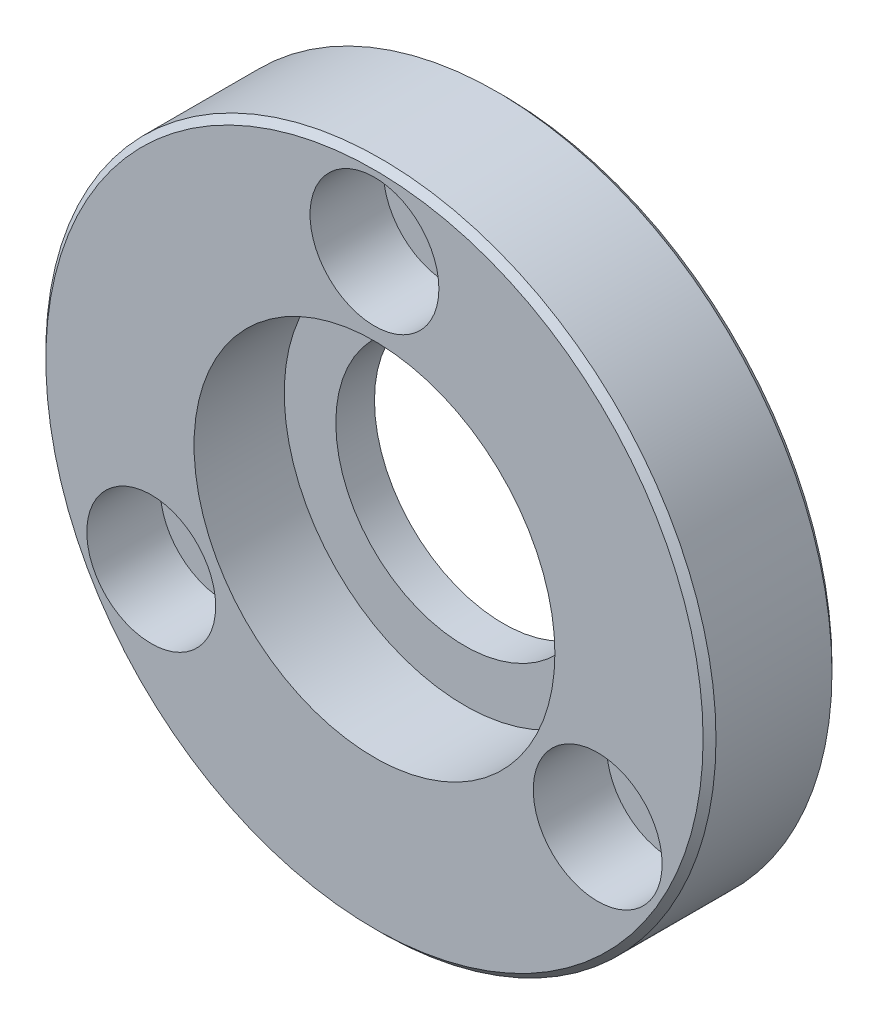
ISO-10303-21;
HEADER;
FILE_DESCRIPTION(('STEP AP214'),'2;1');
FILE_NAME('part.step','',(''),(''),'','','');
FILE_SCHEMA(('AUTOMOTIVE_DESIGN { 1 0 10303 214 1 1 1 1 }'));
ENDSEC;
DATA;
#1=APPLICATION_CONTEXT('core data for automotive mechanical design processes');
#2=APPLICATION_PROTOCOL_DEFINITION('international standard','automotive_design',2000,#1);
#3=PRODUCT_CONTEXT('',#1,'mechanical');
#4=PRODUCT('Part','Part','',(#3));
#5=PRODUCT_RELATED_PRODUCT_CATEGORY('part','',(#4));
#6=PRODUCT_DEFINITION_FORMATION('','',#4);
#7=PRODUCT_DEFINITION_CONTEXT('part definition',#1,'design');
#8=PRODUCT_DEFINITION('design','',#6,#7);
#9=PRODUCT_DEFINITION_SHAPE('','',#8);
#10=(LENGTH_UNIT() NAMED_UNIT(*) SI_UNIT(.MILLI.,.METRE.));
#11=(NAMED_UNIT(*) PLANE_ANGLE_UNIT() SI_UNIT($,.RADIAN.));
#12=(NAMED_UNIT(*) SI_UNIT($,.STERADIAN.) SOLID_ANGLE_UNIT());
#13=UNCERTAINTY_MEASURE_WITH_UNIT(LENGTH_MEASURE(1.E-05),#10,'distance_accuracy_value','');
#14=(GEOMETRIC_REPRESENTATION_CONTEXT(3) GLOBAL_UNCERTAINTY_ASSIGNED_CONTEXT((#13)) GLOBAL_UNIT_ASSIGNED_CONTEXT((#10,
#11,#12)) REPRESENTATION_CONTEXT('',''));
#15=CARTESIAN_POINT('',(0.,0.,0.));
#16=DIRECTION('',(0.,0.,1.));
#17=DIRECTION('',(1.,0.,0.));
#18=AXIS2_PLACEMENT_3D('',#15,#16,#17);
#19=CARTESIAN_POINT('',(0.,0.,5.));
#20=DIRECTION('',(0.,0.,-1.));
#21=DIRECTION('',(-1.,0.,0.));
#22=AXIS2_PLACEMENT_3D('',#19,#20,#21);
#23=CYLINDRICAL_SURFACE('',#22,26.);
#24=CARTESIAN_POINT('',(0.,0.,-4.5));
#25=DIRECTION('',(0.,0.,1.));
#26=DIRECTION('',(1.,0.,0.));
#27=AXIS2_PLACEMENT_3D('',#24,#25,#26);
#28=CIRCLE('',#27,26.);
#29=CARTESIAN_POINT('',(26.,0.,-4.5));
#30=VERTEX_POINT('',#29);
#31=EDGE_CURVE('E45',#30,#30,#28,.T.);
#32=ORIENTED_EDGE('',*,*,#31,.T.);
#33=EDGE_LOOP('',(#32));
#34=FACE_BOUND('',#33,.T.);
#35=CARTESIAN_POINT('',(0.,0.,4.50000000000002));
#36=DIRECTION('',(0.,0.,1.));
#37=DIRECTION('',(1.,0.,0.));
#38=AXIS2_PLACEMENT_3D('',#35,#36,#37);
#39=CIRCLE('',#38,26.);
#40=CARTESIAN_POINT('',(26.,0.,4.50000000000002));
#41=VERTEX_POINT('',#40);
#42=EDGE_CURVE('E49',#41,#41,#39,.F.);
#43=ORIENTED_EDGE('',*,*,#42,.T.);
#44=EDGE_LOOP('',(#43));
#45=FACE_BOUND('',#44,.T.);
#46=ADVANCED_FACE('F34',(#34,#45),#23,.T.);
#47=CARTESIAN_POINT('',(0.,0.,5.));
#48=DIRECTION('',(0.,0.,1.));
#49=DIRECTION('',(1.,0.,0.));
#50=AXIS2_PLACEMENT_3D('',#47,#48,#49);
#51=PLANE('',#50);
#52=CARTESIAN_POINT('',(-17.3205080756889,-9.99999999999984,5.));
#53=DIRECTION('',(0.,0.,1.));
#54=DIRECTION('',(1.,0.,0.));
#55=AXIS2_PLACEMENT_3D('',#52,#53,#54);
#56=CIRCLE('',#55,4.99999999999999);
#57=CARTESIAN_POINT('',(-12.3205080756889,-9.99999999999984,5.));
#58=VERTEX_POINT('',#57);
#59=EDGE_CURVE('E99',#58,#58,#56,.T.);
#60=ORIENTED_EDGE('',*,*,#59,.F.);
#61=EDGE_LOOP('',(#60));
#62=FACE_BOUND('',#61,.T.);
#63=CARTESIAN_POINT('',(17.3205080756887,-10.0000000000001,5.));
#64=DIRECTION('',(0.,0.,1.));
#65=DIRECTION('',(1.,0.,0.));
#66=AXIS2_PLACEMENT_3D('',#63,#64,#65);
#67=CIRCLE('',#66,4.99999999999999);
#68=CARTESIAN_POINT('',(22.3205080756887,-10.0000000000001,5.));
#69=VERTEX_POINT('',#68);
#70=EDGE_CURVE('E87',#69,#69,#67,.T.);
#71=ORIENTED_EDGE('',*,*,#70,.F.);
#72=EDGE_LOOP('',(#71));
#73=FACE_BOUND('',#72,.T.);
#74=CARTESIAN_POINT('',(0.,0.,5.));
#75=DIRECTION('',(0.,0.,1.));
#76=DIRECTION('',(1.,0.,0.));
#77=AXIS2_PLACEMENT_3D('',#74,#75,#76);
#78=CIRCLE('',#77,25.5);
#79=CARTESIAN_POINT('',(25.5,0.,5.));
#80=VERTEX_POINT('',#79);
#81=EDGE_CURVE('E10',#80,#80,#78,.T.);
#82=ORIENTED_EDGE('',*,*,#81,.T.);
#83=EDGE_LOOP('',(#82));
#84=FACE_BOUND('',#83,.T.);
#85=CARTESIAN_POINT('',(0.,20.,5.));
#86=DIRECTION('',(0.,0.,1.));
#87=DIRECTION('',(1.,0.,0.));
#88=AXIS2_PLACEMENT_3D('',#85,#86,#87);
#89=CIRCLE('',#88,4.99999999999999);
#90=CARTESIAN_POINT('',(5.00000000000001,20.,5.));
#91=VERTEX_POINT('',#90);
#92=EDGE_CURVE('E75',#91,#91,#89,.T.);
#93=ORIENTED_EDGE('',*,*,#92,.F.);
#94=EDGE_LOOP('',(#93));
#95=FACE_BOUND('',#94,.T.);
#96=CARTESIAN_POINT('',(0.,0.,5.));
#97=DIRECTION('',(0.,0.,1.));
#98=DIRECTION('',(1.,0.,0.));
#99=AXIS2_PLACEMENT_3D('',#96,#97,#98);
#100=CIRCLE('',#99,14.);
#101=CARTESIAN_POINT('',(14.,0.,5.));
#102=VERTEX_POINT('',#101);
#103=EDGE_CURVE('E55',#102,#102,#100,.T.);
#104=ORIENTED_EDGE('',*,*,#103,.F.);
#105=EDGE_LOOP('',(#104));
#106=FACE_BOUND('',#105,.T.);
#107=ADVANCED_FACE('F105',(#62,#73,#84,#95,#106),#51,.T.);
#108=CARTESIAN_POINT('',(0.,0.,-5.));
#109=DIRECTION('',(0.,0.,1.));
#110=DIRECTION('',(1.,0.,0.));
#111=AXIS2_PLACEMENT_3D('',#108,#109,#110);
#112=PLANE('',#111);
#113=CARTESIAN_POINT('',(-17.3205080756889,-9.99999999999984,-5.));
#114=DIRECTION('',(0.,0.,1.));
#115=DIRECTION('',(1.,0.,0.));
#116=AXIS2_PLACEMENT_3D('',#113,#114,#115);
#117=CIRCLE('',#116,2.75);
#118=CARTESIAN_POINT('',(-14.5705080756889,-9.99999999999984,-5.));
#119=VERTEX_POINT('',#118);
#120=EDGE_CURVE('E90',#119,#119,#117,.T.);
#121=ORIENTED_EDGE('',*,*,#120,.T.);
#122=EDGE_LOOP('',(#121));
#123=FACE_BOUND('',#122,.T.);
#124=CARTESIAN_POINT('',(17.3205080756887,-10.0000000000001,-5.));
#125=DIRECTION('',(0.,0.,1.));
#126=DIRECTION('',(1.,0.,0.));
#127=AXIS2_PLACEMENT_3D('',#124,#125,#126);
#128=CIRCLE('',#127,2.75);
#129=CARTESIAN_POINT('',(20.0705080756887,-10.0000000000001,-5.));
#130=VERTEX_POINT('',#129);
#131=EDGE_CURVE('E78',#130,#130,#128,.T.);
#132=ORIENTED_EDGE('',*,*,#131,.T.);
#133=EDGE_LOOP('',(#132));
#134=FACE_BOUND('',#133,.T.);
#135=CARTESIAN_POINT('',(0.,0.,-5.));
#136=DIRECTION('',(0.,0.,1.));
#137=DIRECTION('',(1.,0.,0.));
#138=AXIS2_PLACEMENT_3D('',#135,#136,#137);
#139=CIRCLE('',#138,25.5);
#140=CARTESIAN_POINT('',(25.5,0.,-5.));
#141=VERTEX_POINT('',#140);
#142=EDGE_CURVE('E41',#141,#141,#139,.F.);
#143=ORIENTED_EDGE('',*,*,#142,.T.);
#144=EDGE_LOOP('',(#143));
#145=FACE_BOUND('',#144,.T.);
#146=CARTESIAN_POINT('',(0.,20.,-5.));
#147=DIRECTION('',(0.,0.,1.));
#148=DIRECTION('',(1.,0.,0.));
#149=AXIS2_PLACEMENT_3D('',#146,#147,#148);
#150=CIRCLE('',#149,2.75);
#151=CARTESIAN_POINT('',(2.75000000000002,20.,-5.));
#152=VERTEX_POINT('',#151);
#153=EDGE_CURVE('E64',#152,#152,#150,.T.);
#154=ORIENTED_EDGE('',*,*,#153,.T.);
#155=EDGE_LOOP('',(#154));
#156=FACE_BOUND('',#155,.T.);
#157=CARTESIAN_POINT('',(0.,0.,-5.));
#158=DIRECTION('',(0.,0.,1.));
#159=DIRECTION('',(1.,0.,0.));
#160=AXIS2_PLACEMENT_3D('',#157,#158,#159);
#161=CIRCLE('',#160,10.);
#162=CARTESIAN_POINT('',(10.,0.,-5.));
#163=VERTEX_POINT('',#162);
#164=EDGE_CURVE('E58',#163,#163,#161,.T.);
#165=ORIENTED_EDGE('',*,*,#164,.T.);
#166=EDGE_LOOP('',(#165));
#167=FACE_BOUND('',#166,.T.);
#168=ADVANCED_FACE('F108',(#123,#134,#145,#156,#167),#112,.F.);
#169=CARTESIAN_POINT('',(0.,0.,-2.));
#170=DIRECTION('',(0.,0.,1.));
#171=DIRECTION('',(1.,0.,0.));
#172=AXIS2_PLACEMENT_3D('',#169,#170,#171);
#173=CYLINDRICAL_SURFACE('',#172,14.);
#174=CARTESIAN_POINT('',(0.,0.,-2.));
#175=DIRECTION('',(0.,0.,1.));
#176=DIRECTION('',(1.,0.,0.));
#177=AXIS2_PLACEMENT_3D('',#174,#175,#176);
#178=CIRCLE('',#177,14.);
#179=CARTESIAN_POINT('',(14.,0.,-2.));
#180=VERTEX_POINT('',#179);
#181=EDGE_CURVE('E54',#180,#180,#178,.T.);
#182=ORIENTED_EDGE('',*,*,#181,.F.);
#183=EDGE_LOOP('',(#182));
#184=FACE_BOUND('',#183,.T.);
#185=ORIENTED_EDGE('',*,*,#103,.T.);
#186=EDGE_LOOP('',(#185));
#187=FACE_BOUND('',#186,.T.);
#188=ADVANCED_FACE('F116',(#184,#187),#173,.F.);
#189=CARTESIAN_POINT('',(0.,0.,-2.));
#190=DIRECTION('',(0.,0.,1.));
#191=DIRECTION('',(1.,0.,0.));
#192=AXIS2_PLACEMENT_3D('',#189,#190,#191);
#193=PLANE('',#192);
#194=CARTESIAN_POINT('',(0.,0.,-2.));
#195=DIRECTION('',(0.,0.,1.));
#196=DIRECTION('',(1.,0.,0.));
#197=AXIS2_PLACEMENT_3D('',#194,#195,#196);
#198=CIRCLE('',#197,10.);
#199=CARTESIAN_POINT('',(10.,0.,-2.));
#200=VERTEX_POINT('',#199);
#201=EDGE_CURVE('E61',#200,#200,#198,.T.);
#202=ORIENTED_EDGE('',*,*,#201,.F.);
#203=EDGE_LOOP('',(#202));
#204=FACE_BOUND('',#203,.T.);
#205=ORIENTED_EDGE('',*,*,#181,.T.);
#206=EDGE_LOOP('',(#205));
#207=FACE_BOUND('',#206,.T.);
#208=ADVANCED_FACE('F118',(#204,#207),#193,.T.);
#209=CARTESIAN_POINT('',(0.,0.,-5.));
#210=DIRECTION('',(0.,0.,1.));
#211=DIRECTION('',(1.,0.,0.));
#212=AXIS2_PLACEMENT_3D('',#209,#210,#211);
#213=CYLINDRICAL_SURFACE('',#212,10.);
#214=ORIENTED_EDGE('',*,*,#164,.F.);
#215=EDGE_LOOP('',(#214));
#216=FACE_BOUND('',#215,.T.);
#217=ORIENTED_EDGE('',*,*,#201,.T.);
#218=EDGE_LOOP('',(#217));
#219=FACE_BOUND('',#218,.T.);
#220=ADVANCED_FACE('F125',(#216,#219),#213,.F.);
#221=CARTESIAN_POINT('',(0.,20.,5.));
#222=DIRECTION('',(0.,0.,1.));
#223=DIRECTION('',(1.,0.,0.));
#224=AXIS2_PLACEMENT_3D('',#221,#222,#223);
#225=CYLINDRICAL_SURFACE('',#224,2.75);
#226=ORIENTED_EDGE('',*,*,#153,.F.);
#227=EDGE_LOOP('',(#226));
#228=FACE_BOUND('',#227,.T.);
#229=CARTESIAN_POINT('',(0.,20.,-0.700000000000006));
#230=DIRECTION('',(0.,0.,1.));
#231=DIRECTION('',(1.,0.,0.));
#232=AXIS2_PLACEMENT_3D('',#229,#230,#231);
#233=CIRCLE('',#232,2.75);
#234=CARTESIAN_POINT('',(2.75000000000002,20.,-0.700000000000006));
#235=VERTEX_POINT('',#234);
#236=EDGE_CURVE('E69',#235,#235,#233,.T.);
#237=ORIENTED_EDGE('',*,*,#236,.T.);
#238=EDGE_LOOP('',(#237));
#239=FACE_BOUND('',#238,.T.);
#240=ADVANCED_FACE('F155',(#228,#239),#225,.F.);
#241=CARTESIAN_POINT('',(2.75,20.,-0.700000000000006));
#242=DIRECTION('',(0.,0.,-1.));
#243=DIRECTION('',(-1.,0.,0.));
#244=AXIS2_PLACEMENT_3D('',#241,#242,#243);
#245=PLANE('',#244);
#246=ORIENTED_EDGE('',*,*,#236,.F.);
#247=EDGE_LOOP('',(#246));
#248=FACE_BOUND('',#247,.T.);
#249=CARTESIAN_POINT('',(0.,20.,-0.700000000000006));
#250=DIRECTION('',(0.,0.,1.));
#251=DIRECTION('',(1.,0.,0.));
#252=AXIS2_PLACEMENT_3D('',#249,#250,#251);
#253=CIRCLE('',#252,5.);
#254=CARTESIAN_POINT('',(5.00000000000001,20.,-0.700000000000006));
#255=VERTEX_POINT('',#254);
#256=EDGE_CURVE('E72',#255,#255,#253,.T.);
#257=ORIENTED_EDGE('',*,*,#256,.T.);
#258=EDGE_LOOP('',(#257));
#259=FACE_BOUND('',#258,.T.);
#260=ADVANCED_FACE('F147',(#248,#259),#245,.F.);
#261=CARTESIAN_POINT('',(0.,20.,5.));
#262=DIRECTION('',(0.,0.,1.));
#263=DIRECTION('',(1.,0.,0.));
#264=AXIS2_PLACEMENT_3D('',#261,#262,#263);
#265=CYLINDRICAL_SURFACE('',#264,4.99999999999999);
#266=ORIENTED_EDGE('',*,*,#256,.F.);
#267=EDGE_LOOP('',(#266));
#268=FACE_BOUND('',#267,.T.);
#269=ORIENTED_EDGE('',*,*,#92,.T.);
#270=EDGE_LOOP('',(#269));
#271=FACE_BOUND('',#270,.T.);
#272=ADVANCED_FACE('F139',(#268,#271),#265,.F.);
#273=CARTESIAN_POINT('',(0.,0.,-4.5));
#274=DIRECTION('',(0.,0.,1.));
#275=DIRECTION('',(1.,0.,0.));
#276=AXIS2_PLACEMENT_3D('',#273,#274,#275);
#277=CONICAL_SURFACE('',#276,26.,0.785398163397452);
#278=ORIENTED_EDGE('',*,*,#142,.F.);
#279=EDGE_LOOP('',(#278));
#280=FACE_BOUND('',#279,.T.);
#281=ORIENTED_EDGE('',*,*,#31,.F.);
#282=EDGE_LOOP('',(#281));
#283=FACE_BOUND('',#282,.T.);
#284=ADVANCED_FACE('F137',(#280,#283),#277,.T.);
#285=CARTESIAN_POINT('',(0.,0.,5.));
#286=DIRECTION('',(0.,0.,-1.));
#287=DIRECTION('',(-1.,0.,0.));
#288=AXIS2_PLACEMENT_3D('',#285,#286,#287);
#289=CONICAL_SURFACE('',#288,25.5,0.785398163397448);
#290=ORIENTED_EDGE('',*,*,#42,.F.);
#291=EDGE_LOOP('',(#290));
#292=FACE_BOUND('',#291,.T.);
#293=ORIENTED_EDGE('',*,*,#81,.F.);
#294=EDGE_LOOP('',(#293));
#295=FACE_BOUND('',#294,.T.);
#296=ADVANCED_FACE('F36',(#292,#295),#289,.T.);
#297=CARTESIAN_POINT('',(17.3205080756887,-10.0000000000001,5.));
#298=DIRECTION('',(0.,0.,1.));
#299=DIRECTION('',(1.,0.,0.));
#300=AXIS2_PLACEMENT_3D('',#297,#298,#299);
#301=CYLINDRICAL_SURFACE('',#300,2.75);
#302=ORIENTED_EDGE('',*,*,#131,.F.);
#303=EDGE_LOOP('',(#302));
#304=FACE_BOUND('',#303,.T.);
#305=CARTESIAN_POINT('',(17.3205080756887,-10.0000000000001,-0.699999999999992));
#306=DIRECTION('',(0.,0.,1.));
#307=DIRECTION('',(1.,0.,0.));
#308=AXIS2_PLACEMENT_3D('',#305,#306,#307);
#309=CIRCLE('',#308,2.75);
#310=CARTESIAN_POINT('',(20.0705080756887,-10.0000000000001,-0.699999999999992));
#311=VERTEX_POINT('',#310);
#312=EDGE_CURVE('E81',#311,#311,#309,.T.);
#313=ORIENTED_EDGE('',*,*,#312,.T.);
#314=EDGE_LOOP('',(#313));
#315=FACE_BOUND('',#314,.T.);
#316=ADVANCED_FACE('F145',(#304,#315),#301,.F.);
#317=CARTESIAN_POINT('',(20.0705080756887,-10.0000000000001,-0.699999999999992));
#318=DIRECTION('',(0.,0.,-1.));
#319=DIRECTION('',(-1.,0.,0.));
#320=AXIS2_PLACEMENT_3D('',#317,#318,#319);
#321=PLANE('',#320);
#322=ORIENTED_EDGE('',*,*,#312,.F.);
#323=EDGE_LOOP('',(#322));
#324=FACE_BOUND('',#323,.T.);
#325=CARTESIAN_POINT('',(17.3205080756887,-10.0000000000001,-0.699999999999992));
#326=DIRECTION('',(0.,0.,1.));
#327=DIRECTION('',(1.,0.,0.));
#328=AXIS2_PLACEMENT_3D('',#325,#326,#327);
#329=CIRCLE('',#328,5.);
#330=CARTESIAN_POINT('',(22.3205080756887,-10.0000000000001,-0.699999999999992));
#331=VERTEX_POINT('',#330);
#332=EDGE_CURVE('E84',#331,#331,#329,.T.);
#333=ORIENTED_EDGE('',*,*,#332,.T.);
#334=EDGE_LOOP('',(#333));
#335=FACE_BOUND('',#334,.T.);
#336=ADVANCED_FACE('F208',(#324,#335),#321,.F.);
#337=CARTESIAN_POINT('',(17.3205080756887,-10.0000000000001,5.));
#338=DIRECTION('',(0.,0.,1.));
#339=DIRECTION('',(1.,0.,0.));
#340=AXIS2_PLACEMENT_3D('',#337,#338,#339);
#341=CYLINDRICAL_SURFACE('',#340,5.);
#342=ORIENTED_EDGE('',*,*,#332,.F.);
#343=EDGE_LOOP('',(#342));
#344=FACE_BOUND('',#343,.T.);
#345=ORIENTED_EDGE('',*,*,#70,.T.);
#346=EDGE_LOOP('',(#345));
#347=FACE_BOUND('',#346,.T.);
#348=ADVANCED_FACE('F217',(#344,#347),#341,.F.);
#349=CARTESIAN_POINT('',(-17.3205080756889,-9.99999999999984,5.));
#350=DIRECTION('',(0.,0.,1.));
#351=DIRECTION('',(1.,0.,0.));
#352=AXIS2_PLACEMENT_3D('',#349,#350,#351);
#353=CYLINDRICAL_SURFACE('',#352,2.75);
#354=ORIENTED_EDGE('',*,*,#120,.F.);
#355=EDGE_LOOP('',(#354));
#356=FACE_BOUND('',#355,.T.);
#357=CARTESIAN_POINT('',(-17.3205080756889,-9.99999999999984,-0.700000000000006));
#358=DIRECTION('',(0.,0.,1.));
#359=DIRECTION('',(1.,0.,0.));
#360=AXIS2_PLACEMENT_3D('',#357,#358,#359);
#361=CIRCLE('',#360,2.75);
#362=CARTESIAN_POINT('',(-14.5705080756889,-9.99999999999984,-0.700000000000006));
#363=VERTEX_POINT('',#362);
#364=EDGE_CURVE('E93',#363,#363,#361,.T.);
#365=ORIENTED_EDGE('',*,*,#364,.T.);
#366=EDGE_LOOP('',(#365));
#367=FACE_BOUND('',#366,.T.);
#368=ADVANCED_FACE('F226',(#356,#367),#353,.F.);
#369=CARTESIAN_POINT('',(-14.5705080756889,-9.99999999999984,-0.700000000000006));
#370=DIRECTION('',(0.,0.,-1.));
#371=DIRECTION('',(-1.,0.,0.));
#372=AXIS2_PLACEMENT_3D('',#369,#370,#371);
#373=PLANE('',#372);
#374=ORIENTED_EDGE('',*,*,#364,.F.);
#375=EDGE_LOOP('',(#374));
#376=FACE_BOUND('',#375,.T.);
#377=CARTESIAN_POINT('',(-17.3205080756889,-9.99999999999984,-0.700000000000006));
#378=DIRECTION('',(0.,0.,1.));
#379=DIRECTION('',(1.,0.,0.));
#380=AXIS2_PLACEMENT_3D('',#377,#378,#379);
#381=CIRCLE('',#380,5.);
#382=CARTESIAN_POINT('',(-12.3205080756889,-9.99999999999984,-0.700000000000006));
#383=VERTEX_POINT('',#382);
#384=EDGE_CURVE('E96',#383,#383,#381,.T.);
#385=ORIENTED_EDGE('',*,*,#384,.T.);
#386=EDGE_LOOP('',(#385));
#387=FACE_BOUND('',#386,.T.);
#388=ADVANCED_FACE('F236',(#376,#387),#373,.F.);
#389=CARTESIAN_POINT('',(-17.3205080756889,-9.99999999999984,5.));
#390=DIRECTION('',(0.,0.,1.));
#391=DIRECTION('',(1.,0.,0.));
#392=AXIS2_PLACEMENT_3D('',#389,#390,#391);
#393=CYLINDRICAL_SURFACE('',#392,4.99999999999999);
#394=ORIENTED_EDGE('',*,*,#384,.F.);
#395=EDGE_LOOP('',(#394));
#396=FACE_BOUND('',#395,.T.);
#397=ORIENTED_EDGE('',*,*,#59,.T.);
#398=EDGE_LOOP('',(#397));
#399=FACE_BOUND('',#398,.T.);
#400=ADVANCED_FACE('F103',(#396,#399),#393,.F.);
#401=CLOSED_SHELL('',(#46,#107,#168,#188,#208,#220,#240,#260,#272,#284,#296,#316,#336,#348,#368,
#388,#400));
#402=MANIFOLD_SOLID_BREP('B2',#401);
#403=ADVANCED_BREP_SHAPE_REPRESENTATION('',(#18,#402),#14);
#404=SHAPE_DEFINITION_REPRESENTATION(#9,#403);
ENDSEC;
END-ISO-10303-21;
